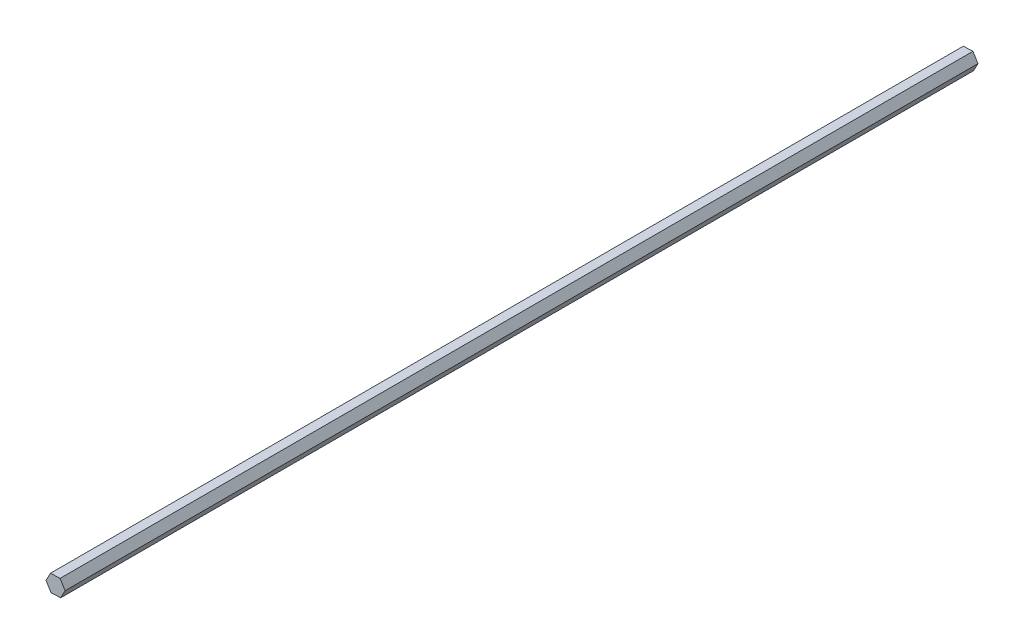
ISO-10303-21;
HEADER;
FILE_DESCRIPTION(('STEP AP214'),'2;1');
FILE_NAME('part.step','',(''),(''),'','','');
FILE_SCHEMA(('AUTOMOTIVE_DESIGN { 1 0 10303 214 1 1 1 1 }'));
ENDSEC;
DATA;
#1=APPLICATION_CONTEXT('core data for automotive mechanical design processes');
#2=APPLICATION_PROTOCOL_DEFINITION('international standard','automotive_design',2000,#1);
#3=PRODUCT_CONTEXT('',#1,'mechanical');
#4=PRODUCT('Part','Part','',(#3));
#5=PRODUCT_RELATED_PRODUCT_CATEGORY('part','',(#4));
#6=PRODUCT_DEFINITION_FORMATION('','',#4);
#7=PRODUCT_DEFINITION_CONTEXT('part definition',#1,'design');
#8=PRODUCT_DEFINITION('design','',#6,#7);
#9=PRODUCT_DEFINITION_SHAPE('','',#8);
#10=(LENGTH_UNIT() NAMED_UNIT(*) SI_UNIT(.MILLI.,.METRE.));
#11=(NAMED_UNIT(*) PLANE_ANGLE_UNIT() SI_UNIT($,.RADIAN.));
#12=(NAMED_UNIT(*) SI_UNIT($,.STERADIAN.) SOLID_ANGLE_UNIT());
#13=UNCERTAINTY_MEASURE_WITH_UNIT(LENGTH_MEASURE(1.E-05),#10,'distance_accuracy_value','');
#14=(GEOMETRIC_REPRESENTATION_CONTEXT(3) GLOBAL_UNCERTAINTY_ASSIGNED_CONTEXT((#13)) GLOBAL_UNIT_ASSIGNED_CONTEXT((#10,
#11,#12)) REPRESENTATION_CONTEXT('',''));
#15=CARTESIAN_POINT('',(0.,0.,0.));
#16=DIRECTION('',(0.,0.,1.));
#17=DIRECTION('',(1.,0.,0.));
#18=AXIS2_PLACEMENT_3D('',#15,#16,#17);
#19=CARTESIAN_POINT('',(-3.45218136658597,-6.46883120397572,698.5));
#20=DIRECTION('',(-0.0333779610675189,0.999442800621914,0.));
#21=DIRECTION('',(-0.999442800621914,-0.0333779610675189,0.));
#22=AXIS2_PLACEMENT_3D('',#19,#20,#21);
#23=PLANE('',#22);
#24=DIRECTION('',(0.999442800621914,0.0333779610675189,0.));
#25=VECTOR('',#24,1.);
#26=CARTESIAN_POINT('',(-3.45218136658597,-6.46883120397572,0.));
#27=LINE('',#26,#25);
#28=CARTESIAN_POINT('',(-3.45218136658597,-6.46883120397572,0.));
#29=VERTEX_POINT('',#28);
#30=CARTESIAN_POINT('',(3.87608147214346,-6.22409236392259,0.));
#31=VERTEX_POINT('',#30);
#32=EDGE_CURVE('E123',#29,#31,#27,.T.);
#33=ORIENTED_EDGE('',*,*,#32,.T.);
#34=DIRECTION('',(0.,0.,-1.));
#35=VECTOR('',#34,1.);
#36=CARTESIAN_POINT('',(3.87608147214346,-6.22409236392259,698.5));
#37=LINE('',#36,#35);
#38=CARTESIAN_POINT('',(3.87608147214346,-6.22409236392259,698.5));
#39=VERTEX_POINT('',#38);
#40=EDGE_CURVE('E11',#39,#31,#37,.T.);
#41=ORIENTED_EDGE('',*,*,#40,.F.);
#42=DIRECTION('',(0.999442800621914,0.0333779610675189,0.));
#43=VECTOR('',#42,1.);
#44=CARTESIAN_POINT('',(-3.45218136658597,-6.46883120397572,698.5));
#45=LINE('',#44,#43);
#46=CARTESIAN_POINT('',(-3.45218136658597,-6.46883120397572,698.5));
#47=VERTEX_POINT('',#46);
#48=EDGE_CURVE('E133',#47,#39,#45,.T.);
#49=ORIENTED_EDGE('',*,*,#48,.F.);
#50=DIRECTION('',(0.,0.,-1.));
#51=VECTOR('',#50,1.);
#52=CARTESIAN_POINT('',(-3.45218136658597,-6.46883120397572,698.5));
#53=LINE('',#52,#51);
#54=EDGE_CURVE('E119',#47,#29,#53,.T.);
#55=ORIENTED_EDGE('',*,*,#54,.T.);
#56=EDGE_LOOP('',(#33,#41,#49,#55));
#57=FACE_BOUND('',#56,.T.);
#58=ADVANCED_FACE('F39',(#57),#23,.F.);
#59=CARTESIAN_POINT('',(3.87608147214346,-6.22409236392259,698.5));
#60=DIRECTION('',(-0.882231835501803,0.470815238099958,0.));
#61=DIRECTION('',(-0.470815238099958,-0.882231835501803,0.));
#62=AXIS2_PLACEMENT_3D('',#59,#60,#61);
#63=PLANE('',#62);
#64=DIRECTION('',(0.470815238099958,0.882231835501803,0.));
#65=VECTOR('',#64,1.);
#66=CARTESIAN_POINT('',(3.87608147214346,-6.22409236392259,0.));
#67=LINE('',#66,#65);
#68=CARTESIAN_POINT('',(7.32826283872943,0.24473884005313,0.));
#69=VERTEX_POINT('',#68);
#70=EDGE_CURVE('E126',#31,#69,#67,.T.);
#71=ORIENTED_EDGE('',*,*,#70,.T.);
#72=DIRECTION('',(0.,0.,-1.));
#73=VECTOR('',#72,1.);
#74=CARTESIAN_POINT('',(7.32826283872943,0.24473884005313,698.5));
#75=LINE('',#74,#73);
#76=CARTESIAN_POINT('',(7.32826283872943,0.24473884005313,698.5));
#77=VERTEX_POINT('',#76);
#78=EDGE_CURVE('E47',#77,#69,#75,.T.);
#79=ORIENTED_EDGE('',*,*,#78,.F.);
#80=DIRECTION('',(0.470815238099958,0.882231835501803,0.));
#81=VECTOR('',#80,1.);
#82=CARTESIAN_POINT('',(3.87608147214346,-6.22409236392259,698.5));
#83=LINE('',#82,#81);
#84=EDGE_CURVE('E92',#39,#77,#83,.T.);
#85=ORIENTED_EDGE('',*,*,#84,.F.);
#86=ORIENTED_EDGE('',*,*,#40,.T.);
#87=EDGE_LOOP('',(#71,#79,#85,#86));
#88=FACE_BOUND('',#87,.T.);
#89=ADVANCED_FACE('F157',(#88),#63,.F.);
#90=CARTESIAN_POINT('',(7.32826283872943,0.24473884005313,698.5));
#91=DIRECTION('',(-0.848853874434284,-0.528627562521956,0.));
#92=DIRECTION('',(0.528627562521956,-0.848853874434284,0.));
#93=AXIS2_PLACEMENT_3D('',#90,#91,#92);
#94=PLANE('',#93);
#95=DIRECTION('',(-0.528627562521956,0.848853874434284,0.));
#96=VECTOR('',#95,1.);
#97=CARTESIAN_POINT('',(7.32826283872943,0.24473884005313,0.));
#98=LINE('',#97,#96);
#99=CARTESIAN_POINT('',(3.45218136658597,6.46883120397572,0.));
#100=VERTEX_POINT('',#99);
#101=EDGE_CURVE('E128',#69,#100,#98,.T.);
#102=ORIENTED_EDGE('',*,*,#101,.T.);
#103=DIRECTION('',(0.,0.,-1.));
#104=VECTOR('',#103,1.);
#105=CARTESIAN_POINT('',(3.45218136658597,6.46883120397572,698.5));
#106=LINE('',#105,#104);
#107=CARTESIAN_POINT('',(3.45218136658597,6.46883120397572,698.5));
#108=VERTEX_POINT('',#107);
#109=EDGE_CURVE('E114',#108,#100,#106,.T.);
#110=ORIENTED_EDGE('',*,*,#109,.F.);
#111=DIRECTION('',(-0.528627562521956,0.848853874434284,0.));
#112=VECTOR('',#111,1.);
#113=CARTESIAN_POINT('',(7.32826283872943,0.24473884005313,698.5));
#114=LINE('',#113,#112);
#115=EDGE_CURVE('E105',#77,#108,#114,.T.);
#116=ORIENTED_EDGE('',*,*,#115,.F.);
#117=ORIENTED_EDGE('',*,*,#78,.T.);
#118=EDGE_LOOP('',(#102,#110,#116,#117));
#119=FACE_BOUND('',#118,.T.);
#120=ADVANCED_FACE('F139',(#119),#94,.F.);
#121=CARTESIAN_POINT('',(3.45218136658597,6.46883120397572,698.5));
#122=DIRECTION('',(0.0333779610675187,-0.999442800621914,0.));
#123=DIRECTION('',(0.999442800621914,0.0333779610675187,0.));
#124=AXIS2_PLACEMENT_3D('',#121,#122,#123);
#125=PLANE('',#124);
#126=DIRECTION('',(-0.999442800621914,-0.0333779610675187,0.));
#127=VECTOR('',#126,1.);
#128=CARTESIAN_POINT('',(3.45218136658597,6.46883120397572,0.));
#129=LINE('',#128,#127);
#130=CARTESIAN_POINT('',(-3.87608147214346,6.22409236392259,0.));
#131=VERTEX_POINT('',#130);
#132=EDGE_CURVE('E113',#100,#131,#129,.T.);
#133=ORIENTED_EDGE('',*,*,#132,.T.);
#134=DIRECTION('',(0.,0.,-1.));
#135=VECTOR('',#134,1.);
#136=CARTESIAN_POINT('',(-3.87608147214346,6.22409236392259,698.5));
#137=LINE('',#136,#135);
#138=CARTESIAN_POINT('',(-3.87608147214346,6.22409236392259,698.5));
#139=VERTEX_POINT('',#138);
#140=EDGE_CURVE('E110',#139,#131,#137,.T.);
#141=ORIENTED_EDGE('',*,*,#140,.F.);
#142=DIRECTION('',(-0.999442800621914,-0.0333779610675187,0.));
#143=VECTOR('',#142,1.);
#144=CARTESIAN_POINT('',(3.45218136658597,6.46883120397572,698.5));
#145=LINE('',#144,#143);
#146=EDGE_CURVE('E99',#108,#139,#145,.T.);
#147=ORIENTED_EDGE('',*,*,#146,.F.);
#148=ORIENTED_EDGE('',*,*,#109,.T.);
#149=EDGE_LOOP('',(#133,#141,#147,#148));
#150=FACE_BOUND('',#149,.T.);
#151=ADVANCED_FACE('F111',(#150),#125,.F.);
#152=CARTESIAN_POINT('',(-3.87608147214346,6.22409236392259,698.5));
#153=DIRECTION('',(0.882231835501803,-0.470815238099958,0.));
#154=DIRECTION('',(0.470815238099958,0.882231835501803,0.));
#155=AXIS2_PLACEMENT_3D('',#152,#153,#154);
#156=PLANE('',#155);
#157=DIRECTION('',(-0.470815238099958,-0.882231835501803,0.));
#158=VECTOR('',#157,1.);
#159=CARTESIAN_POINT('',(-3.87608147214346,6.22409236392259,0.));
#160=LINE('',#159,#158);
#161=CARTESIAN_POINT('',(-7.32826283872943,-0.244738840053125,0.));
#162=VERTEX_POINT('',#161);
#163=EDGE_CURVE('E78',#131,#162,#160,.T.);
#164=ORIENTED_EDGE('',*,*,#163,.T.);
#165=DIRECTION('',(0.,0.,-1.));
#166=VECTOR('',#165,1.);
#167=CARTESIAN_POINT('',(-7.32826283872943,-0.244738840053125,698.5));
#168=LINE('',#167,#166);
#169=CARTESIAN_POINT('',(-7.32826283872943,-0.244738840053125,698.5));
#170=VERTEX_POINT('',#169);
#171=EDGE_CURVE('E115',#170,#162,#168,.T.);
#172=ORIENTED_EDGE('',*,*,#171,.F.);
#173=DIRECTION('',(-0.470815238099958,-0.882231835501803,0.));
#174=VECTOR('',#173,1.);
#175=CARTESIAN_POINT('',(-3.87608147214346,6.22409236392259,698.5));
#176=LINE('',#175,#174);
#177=EDGE_CURVE('E103',#139,#170,#176,.T.);
#178=ORIENTED_EDGE('',*,*,#177,.F.);
#179=ORIENTED_EDGE('',*,*,#140,.T.);
#180=EDGE_LOOP('',(#164,#172,#178,#179));
#181=FACE_BOUND('',#180,.T.);
#182=ADVANCED_FACE('F117',(#181),#156,.F.);
#183=CARTESIAN_POINT('',(-7.32826283872943,-0.244738840053125,698.5));
#184=DIRECTION('',(0.848853874434284,0.528627562521956,0.));
#185=DIRECTION('',(-0.528627562521956,0.848853874434284,0.));
#186=AXIS2_PLACEMENT_3D('',#183,#184,#185);
#187=PLANE('',#186);
#188=DIRECTION('',(0.528627562521956,-0.848853874434284,0.));
#189=VECTOR('',#188,1.);
#190=CARTESIAN_POINT('',(-7.32826283872943,-0.244738840053125,0.));
#191=LINE('',#190,#189);
#192=EDGE_CURVE('E84',#162,#29,#191,.T.);
#193=ORIENTED_EDGE('',*,*,#192,.T.);
#194=ORIENTED_EDGE('',*,*,#54,.F.);
#195=DIRECTION('',(0.528627562521956,-0.848853874434284,0.));
#196=VECTOR('',#195,1.);
#197=CARTESIAN_POINT('',(-7.32826283872943,-0.244738840053125,698.5));
#198=LINE('',#197,#196);
#199=EDGE_CURVE('E55',#170,#47,#198,.T.);
#200=ORIENTED_EDGE('',*,*,#199,.F.);
#201=ORIENTED_EDGE('',*,*,#171,.T.);
#202=EDGE_LOOP('',(#193,#194,#200,#201));
#203=FACE_BOUND('',#202,.T.);
#204=ADVANCED_FACE('F146',(#203),#187,.F.);
#205=CARTESIAN_POINT('',(0.,0.,698.5));
#206=DIRECTION('',(0.,0.,1.));
#207=DIRECTION('',(1.,0.,0.));
#208=AXIS2_PLACEMENT_3D('',#205,#206,#207);
#209=PLANE('',#208);
#210=ORIENTED_EDGE('',*,*,#48,.T.);
#211=ORIENTED_EDGE('',*,*,#84,.T.);
#212=ORIENTED_EDGE('',*,*,#115,.T.);
#213=ORIENTED_EDGE('',*,*,#146,.T.);
#214=ORIENTED_EDGE('',*,*,#177,.T.);
#215=ORIENTED_EDGE('',*,*,#199,.T.);
#216=EDGE_LOOP('',(#210,#211,#212,#213,#214,#215));
#217=FACE_BOUND('',#216,.T.);
#218=ADVANCED_FACE('F101',(#217),#209,.T.);
#219=CARTESIAN_POINT('',(0.,0.,0.));
#220=DIRECTION('',(0.,0.,1.));
#221=DIRECTION('',(1.,0.,0.));
#222=AXIS2_PLACEMENT_3D('',#219,#220,#221);
#223=PLANE('',#222);
#224=ORIENTED_EDGE('',*,*,#32,.F.);
#225=ORIENTED_EDGE('',*,*,#192,.F.);
#226=ORIENTED_EDGE('',*,*,#163,.F.);
#227=ORIENTED_EDGE('',*,*,#132,.F.);
#228=ORIENTED_EDGE('',*,*,#101,.F.);
#229=ORIENTED_EDGE('',*,*,#70,.F.);
#230=EDGE_LOOP('',(#224,#225,#226,#227,#228,#229));
#231=FACE_BOUND('',#230,.T.);
#232=ADVANCED_FACE('F142',(#231),#223,.F.);
#233=CLOSED_SHELL('',(#58,#89,#120,#151,#182,#204,#218,#232));
#234=MANIFOLD_SOLID_BREP('B2',#233);
#235=ADVANCED_BREP_SHAPE_REPRESENTATION('',(#18,#234),#14);
#236=SHAPE_DEFINITION_REPRESENTATION(#9,#235);
ENDSEC;
END-ISO-10303-21;
